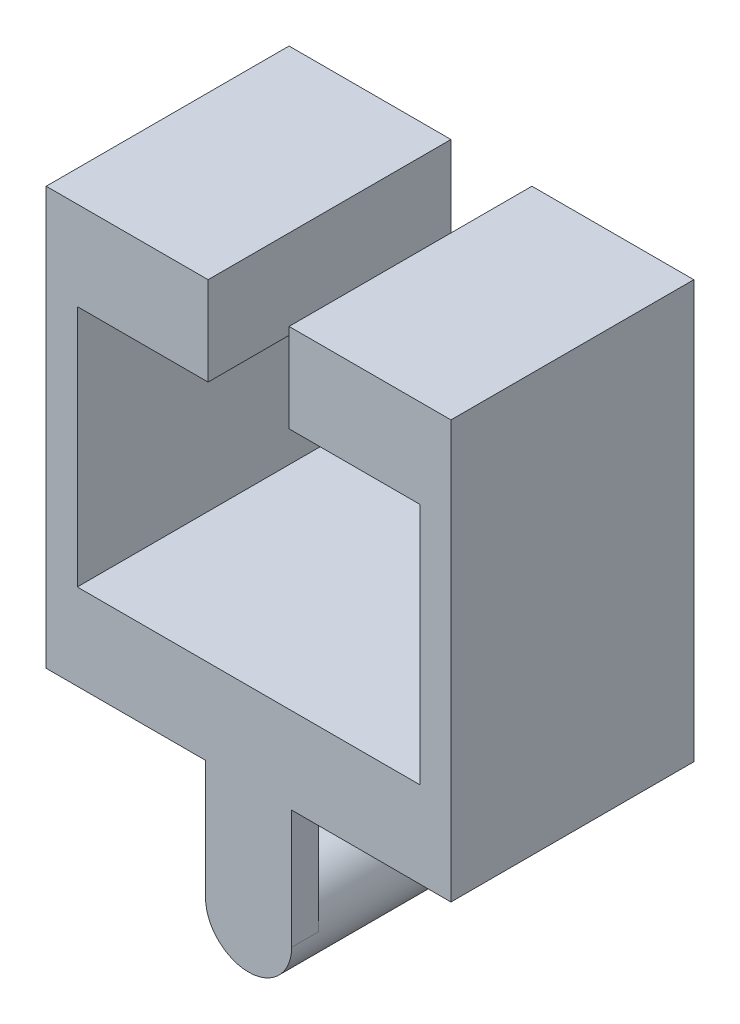
ISO-10303-21;
HEADER;
FILE_DESCRIPTION(('STEP AP214'),'2;1');
FILE_NAME('part.step','',(''),(''),'','','');
FILE_SCHEMA(('AUTOMOTIVE_DESIGN { 1 0 10303 214 1 1 1 1 }'));
ENDSEC;
DATA;
#1=APPLICATION_CONTEXT('core data for automotive mechanical design processes');
#2=APPLICATION_PROTOCOL_DEFINITION('international standard','automotive_design',2000,#1);
#3=PRODUCT_CONTEXT('',#1,'mechanical');
#4=PRODUCT('Part','Part','',(#3));
#5=PRODUCT_RELATED_PRODUCT_CATEGORY('part','',(#4));
#6=PRODUCT_DEFINITION_FORMATION('','',#4);
#7=PRODUCT_DEFINITION_CONTEXT('part definition',#1,'design');
#8=PRODUCT_DEFINITION('design','',#6,#7);
#9=PRODUCT_DEFINITION_SHAPE('','',#8);
#10=(LENGTH_UNIT() NAMED_UNIT(*) SI_UNIT(.MILLI.,.METRE.));
#11=(NAMED_UNIT(*) PLANE_ANGLE_UNIT() SI_UNIT($,.RADIAN.));
#12=(NAMED_UNIT(*) SI_UNIT($,.STERADIAN.) SOLID_ANGLE_UNIT());
#13=UNCERTAINTY_MEASURE_WITH_UNIT(LENGTH_MEASURE(1.E-05),#10,'distance_accuracy_value','');
#14=(GEOMETRIC_REPRESENTATION_CONTEXT(3) GLOBAL_UNCERTAINTY_ASSIGNED_CONTEXT((#13)) GLOBAL_UNIT_ASSIGNED_CONTEXT((#10,
#11,#12)) REPRESENTATION_CONTEXT('',''));
#15=CARTESIAN_POINT('',(0.,0.,0.));
#16=DIRECTION('',(0.,0.,1.));
#17=DIRECTION('',(1.,0.,0.));
#18=AXIS2_PLACEMENT_3D('',#15,#16,#17);
#19=CARTESIAN_POINT('',(0.,32.13862,0.));
#20=DIRECTION('',(0.,-1.,0.));
#21=DIRECTION('',(0.,0.,-1.));
#22=AXIS2_PLACEMENT_3D('',#19,#20,#21);
#23=PLANE('',#22);
#24=DIRECTION('',(0.,0.,-1.));
#25=VECTOR('',#24,1.);
#26=CARTESIAN_POINT('',(-26.8732,32.13862,38.1));
#27=LINE('',#26,#25);
#28=CARTESIAN_POINT('',(-26.8732,32.13862,38.1));
#29=VERTEX_POINT('',#28);
#30=CARTESIAN_POINT('',(-26.8732,32.13862,0.));
#31=VERTEX_POINT('',#30);
#32=EDGE_CURVE('E8382',#29,#31,#27,.T.);
#33=ORIENTED_EDGE('',*,*,#32,.F.);
#34=DIRECTION('',(1.,0.,0.));
#35=VECTOR('',#34,1.);
#36=CARTESIAN_POINT('',(0.,32.13862,38.1));
#37=LINE('',#36,#35);
#38=CARTESIAN_POINT('',(26.8732,32.13862,38.1));
#39=VERTEX_POINT('',#38);
#40=EDGE_CURVE('E8592',#29,#39,#37,.T.);
#41=ORIENTED_EDGE('',*,*,#40,.T.);
#42=DIRECTION('',(0.,0.,1.));
#43=VECTOR('',#42,1.);
#44=CARTESIAN_POINT('',(26.8732,32.13862,38.1));
#45=LINE('',#44,#43);
#46=CARTESIAN_POINT('',(26.8732,32.13862,0.));
#47=VERTEX_POINT('',#46);
#48=EDGE_CURVE('E8378',#47,#39,#45,.T.);
#49=ORIENTED_EDGE('',*,*,#48,.F.);
#50=DIRECTION('',(-1.,0.,0.));
#51=VECTOR('',#50,1.);
#52=CARTESIAN_POINT('',(-31.75,32.13862,0.));
#53=LINE('',#52,#51);
#54=EDGE_CURVE('E8488',#47,#31,#53,.T.);
#55=ORIENTED_EDGE('',*,*,#54,.T.);
#56=EDGE_LOOP('',(#33,#41,#49,#55));
#57=FACE_BOUND('',#56,.T.);
#58=ADVANCED_FACE('F8361',(#57),#23,.F.);
#59=CARTESIAN_POINT('',(0.,0.,38.1));
#60=DIRECTION('',(0.,0.,-1.));
#61=DIRECTION('',(-1.,0.,0.));
#62=AXIS2_PLACEMENT_3D('',#59,#60,#61);
#63=CYLINDRICAL_SURFACE('',#62,6.7564);
#64=CARTESIAN_POINT('',(0.,0.,33.86074));
#65=DIRECTION('',(0.,0.,1.));
#66=DIRECTION('',(1.,0.,0.));
#67=AXIS2_PLACEMENT_3D('',#64,#65,#66);
#68=CIRCLE('',#67,6.7564);
#69=CARTESIAN_POINT('',(6.7564,0.,33.86074));
#70=VERTEX_POINT('',#69);
#71=CARTESIAN_POINT('',(-6.7564,0.,33.86074));
#72=VERTEX_POINT('',#71);
#73=EDGE_CURVE('E14',#70,#72,#68,.T.);
#74=ORIENTED_EDGE('',*,*,#73,.F.);
#75=DIRECTION('',(0.,0.,1.));
#76=VECTOR('',#75,1.);
#77=CARTESIAN_POINT('',(6.7564,0.,33.86074));
#78=LINE('',#77,#76);
#79=CARTESIAN_POINT('',(6.7564,0.,38.1));
#80=VERTEX_POINT('',#79);
#81=EDGE_CURVE('E8638',#70,#80,#78,.T.);
#82=ORIENTED_EDGE('',*,*,#81,.T.);
#83=CARTESIAN_POINT('',(0.,0.,38.1));
#84=DIRECTION('',(0.,0.,1.));
#85=DIRECTION('',(1.,0.,0.));
#86=AXIS2_PLACEMENT_3D('',#83,#84,#85);
#87=CIRCLE('',#86,6.7564);
#88=CARTESIAN_POINT('',(-6.7564,0.,38.1));
#89=VERTEX_POINT('',#88);
#90=EDGE_CURVE('E8372',#89,#80,#87,.T.);
#91=ORIENTED_EDGE('',*,*,#90,.F.);
#92=DIRECTION('',(0.,0.,1.));
#93=VECTOR('',#92,1.);
#94=CARTESIAN_POINT('',(-6.7564,0.,33.86074));
#95=LINE('',#94,#93);
#96=EDGE_CURVE('E8644',#72,#89,#95,.T.);
#97=ORIENTED_EDGE('',*,*,#96,.F.);
#98=EDGE_LOOP('',(#74,#82,#91,#97));
#99=FACE_BOUND('',#98,.T.);
#100=CARTESIAN_POINT('',(0.,0.,0.));
#101=DIRECTION('',(0.,0.,1.));
#102=DIRECTION('',(1.,0.,0.));
#103=AXIS2_PLACEMENT_3D('',#100,#101,#102);
#104=CIRCLE('',#103,6.7564);
#105=CARTESIAN_POINT('',(6.7564,0.,0.));
#106=VERTEX_POINT('',#105);
#107=EDGE_CURVE('E8641',#106,#106,#104,.T.);
#108=ORIENTED_EDGE('',*,*,#107,.T.);
#109=EDGE_LOOP('',(#108));
#110=FACE_BOUND('',#109,.T.);
#111=ADVANCED_FACE('F8368',(#99,#110),#63,.T.);
#112=CARTESIAN_POINT('',(0.,0.,38.1));
#113=DIRECTION('',(0.,0.,1.));
#114=DIRECTION('',(1.,0.,0.));
#115=AXIS2_PLACEMENT_3D('',#112,#113,#114);
#116=PLANE('',#115);
#117=ORIENTED_EDGE('',*,*,#90,.T.);
#118=DIRECTION('',(0.,1.,0.));
#119=VECTOR('',#118,1.);
#120=CARTESIAN_POINT('',(6.7564,0.,38.1));
#121=LINE('',#120,#119);
#122=CARTESIAN_POINT('',(6.7564,18.6436,38.1));
#123=VERTEX_POINT('',#122);
#124=EDGE_CURVE('E8619',#80,#123,#121,.T.);
#125=ORIENTED_EDGE('',*,*,#124,.T.);
#126=DIRECTION('',(1.,0.,0.));
#127=VECTOR('',#126,1.);
#128=CARTESIAN_POINT('',(0.,18.6436,38.1));
#129=LINE('',#128,#127);
#130=CARTESIAN_POINT('',(31.75,18.6436,38.1));
#131=VERTEX_POINT('',#130);
#132=EDGE_CURVE('E8606',#123,#131,#129,.T.);
#133=ORIENTED_EDGE('',*,*,#132,.T.);
#134=DIRECTION('',(0.,-1.,0.));
#135=VECTOR('',#134,1.);
#136=CARTESIAN_POINT('',(31.75,32.13862,38.1));
#137=LINE('',#136,#135);
#138=CARTESIAN_POINT('',(31.75,84.1502,38.1));
#139=VERTEX_POINT('',#138);
#140=EDGE_CURVE('E8614',#139,#131,#137,.T.);
#141=ORIENTED_EDGE('',*,*,#140,.F.);
#142=DIRECTION('',(1.,0.,0.));
#143=VECTOR('',#142,1.);
#144=CARTESIAN_POINT('',(31.75,84.1502,38.1));
#145=LINE('',#144,#143);
#146=CARTESIAN_POINT('',(6.35,84.1502,38.1));
#147=VERTEX_POINT('',#146);
#148=EDGE_CURVE('E8554',#147,#139,#145,.T.);
#149=ORIENTED_EDGE('',*,*,#148,.F.);
#150=DIRECTION('',(0.,-1.,0.));
#151=VECTOR('',#150,1.);
#152=CARTESIAN_POINT('',(6.35,84.1502,38.1));
#153=LINE('',#152,#151);
#154=CARTESIAN_POINT('',(6.35,70.23862,38.1));
#155=VERTEX_POINT('',#154);
#156=EDGE_CURVE('E8540',#147,#155,#153,.T.);
#157=ORIENTED_EDGE('',*,*,#156,.T.);
#158=DIRECTION('',(1.,0.,0.));
#159=VECTOR('',#158,1.);
#160=CARTESIAN_POINT('',(31.75,70.23862,38.1));
#161=LINE('',#160,#159);
#162=CARTESIAN_POINT('',(26.8732,70.23862,38.1));
#163=VERTEX_POINT('',#162);
#164=EDGE_CURVE('E8545',#155,#163,#161,.T.);
#165=ORIENTED_EDGE('',*,*,#164,.T.);
#166=DIRECTION('',(0.,-1.,0.));
#167=VECTOR('',#166,1.);
#168=CARTESIAN_POINT('',(26.8732,70.23862,38.1));
#169=LINE('',#168,#167);
#170=EDGE_CURVE('E8584',#163,#39,#169,.T.);
#171=ORIENTED_EDGE('',*,*,#170,.T.);
#172=ORIENTED_EDGE('',*,*,#40,.F.);
#173=DIRECTION('',(0.,-1.,0.));
#174=VECTOR('',#173,1.);
#175=CARTESIAN_POINT('',(-26.8732,70.23862,38.1));
#176=LINE('',#175,#174);
#177=CARTESIAN_POINT('',(-26.8732,70.23862,38.1));
#178=VERTEX_POINT('',#177);
#179=EDGE_CURVE('E8574',#178,#29,#176,.T.);
#180=ORIENTED_EDGE('',*,*,#179,.F.);
#181=DIRECTION('',(1.,0.,0.));
#182=VECTOR('',#181,1.);
#183=CARTESIAN_POINT('',(-31.75,70.23862,38.1));
#184=LINE('',#183,#182);
#185=CARTESIAN_POINT('',(-6.35,70.23862,38.1));
#186=VERTEX_POINT('',#185);
#187=EDGE_CURVE('E8521',#178,#186,#184,.T.);
#188=ORIENTED_EDGE('',*,*,#187,.T.);
#189=DIRECTION('',(0.,-1.,0.));
#190=VECTOR('',#189,1.);
#191=CARTESIAN_POINT('',(-6.35,84.1502,38.1));
#192=LINE('',#191,#190);
#193=CARTESIAN_POINT('',(-6.35,84.1502,38.1));
#194=VERTEX_POINT('',#193);
#195=EDGE_CURVE('E8500',#194,#186,#192,.T.);
#196=ORIENTED_EDGE('',*,*,#195,.F.);
#197=DIRECTION('',(1.,0.,0.));
#198=VECTOR('',#197,1.);
#199=CARTESIAN_POINT('',(-31.75,84.1502,38.1));
#200=LINE('',#199,#198);
#201=CARTESIAN_POINT('',(-31.75,84.1502,38.1));
#202=VERTEX_POINT('',#201);
#203=EDGE_CURVE('E8491',#202,#194,#200,.T.);
#204=ORIENTED_EDGE('',*,*,#203,.F.);
#205=DIRECTION('',(0.,-1.,0.));
#206=VECTOR('',#205,1.);
#207=CARTESIAN_POINT('',(-31.75,32.13862,38.1));
#208=LINE('',#207,#206);
#209=CARTESIAN_POINT('',(-31.75,18.6436,38.1));
#210=VERTEX_POINT('',#209);
#211=EDGE_CURVE('E8480',#202,#210,#208,.T.);
#212=ORIENTED_EDGE('',*,*,#211,.T.);
#213=CARTESIAN_POINT('',(-6.7564,18.6436,38.1));
#214=VERTEX_POINT('',#213);
#215=EDGE_CURVE('E8597',#210,#214,#129,.T.);
#216=ORIENTED_EDGE('',*,*,#215,.T.);
#217=DIRECTION('',(0.,-1.,0.));
#218=VECTOR('',#217,1.);
#219=CARTESIAN_POINT('',(-6.7564,18.6436,38.1));
#220=LINE('',#219,#218);
#221=EDGE_CURVE('E8624',#214,#89,#220,.T.);
#222=ORIENTED_EDGE('',*,*,#221,.T.);
#223=EDGE_LOOP('',(#117,#125,#133,#141,#149,#157,#165,#171,#172,#180,#188,#196,#204,#212,#216,#222));
#224=FACE_BOUND('',#223,.T.);
#225=ADVANCED_FACE('F8492',(#224),#116,.T.);
#226=CARTESIAN_POINT('',(0.,0.,0.));
#227=DIRECTION('',(0.,0.,1.));
#228=DIRECTION('',(1.,0.,0.));
#229=AXIS2_PLACEMENT_3D('',#226,#227,#228);
#230=PLANE('',#229);
#231=ORIENTED_EDGE('',*,*,#107,.F.);
#232=EDGE_LOOP('',(#231));
#233=FACE_BOUND('',#232,.T.);
#234=ADVANCED_FACE('F8661',(#233),#230,.F.);
#235=CARTESIAN_POINT('',(6.7564,0.,33.86074));
#236=DIRECTION('',(1.,0.,0.));
#237=DIRECTION('',(0.,1.,0.));
#238=AXIS2_PLACEMENT_3D('',#235,#236,#237);
#239=PLANE('',#238);
#240=ORIENTED_EDGE('',*,*,#124,.F.);
#241=ORIENTED_EDGE('',*,*,#81,.F.);
#242=DIRECTION('',(0.,1.,0.));
#243=VECTOR('',#242,1.);
#244=CARTESIAN_POINT('',(6.7564,0.,33.86074));
#245=LINE('',#244,#243);
#246=CARTESIAN_POINT('',(6.7564,18.6436,33.86074));
#247=VERTEX_POINT('',#246);
#248=EDGE_CURVE('E8617',#70,#247,#245,.T.);
#249=ORIENTED_EDGE('',*,*,#248,.T.);
#250=DIRECTION('',(0.,0.,1.));
#251=VECTOR('',#250,1.);
#252=CARTESIAN_POINT('',(6.7564,18.6436,33.86074));
#253=LINE('',#252,#251);
#254=EDGE_CURVE('E8632',#247,#123,#253,.T.);
#255=ORIENTED_EDGE('',*,*,#254,.T.);
#256=EDGE_LOOP('',(#240,#241,#249,#255));
#257=FACE_BOUND('',#256,.T.);
#258=ADVANCED_FACE('F8662',(#257),#239,.T.);
#259=CARTESIAN_POINT('',(-6.7564,18.6436,33.86074));
#260=DIRECTION('',(-1.,0.,0.));
#261=DIRECTION('',(0.,-1.,0.));
#262=AXIS2_PLACEMENT_3D('',#259,#260,#261);
#263=PLANE('',#262);
#264=ORIENTED_EDGE('',*,*,#221,.F.);
#265=DIRECTION('',(0.,0.,1.));
#266=VECTOR('',#265,1.);
#267=CARTESIAN_POINT('',(-6.7564,18.6436,33.86074));
#268=LINE('',#267,#266);
#269=CARTESIAN_POINT('',(-6.7564,18.6436,33.86074));
#270=VERTEX_POINT('',#269);
#271=EDGE_CURVE('E8647',#270,#214,#268,.T.);
#272=ORIENTED_EDGE('',*,*,#271,.F.);
#273=DIRECTION('',(0.,-1.,0.));
#274=VECTOR('',#273,1.);
#275=CARTESIAN_POINT('',(-6.7564,18.6436,33.86074));
#276=LINE('',#275,#274);
#277=EDGE_CURVE('E8627',#270,#72,#276,.T.);
#278=ORIENTED_EDGE('',*,*,#277,.T.);
#279=ORIENTED_EDGE('',*,*,#96,.T.);
#280=EDGE_LOOP('',(#264,#272,#278,#279));
#281=FACE_BOUND('',#280,.T.);
#282=ADVANCED_FACE('F8666',(#281),#263,.T.);
#283=CARTESIAN_POINT('',(0.,0.,33.86074));
#284=DIRECTION('',(0.,0.,1.));
#285=DIRECTION('',(1.,0.,0.));
#286=AXIS2_PLACEMENT_3D('',#283,#284,#285);
#287=PLANE('',#286);
#288=ORIENTED_EDGE('',*,*,#248,.F.);
#289=ORIENTED_EDGE('',*,*,#73,.T.);
#290=ORIENTED_EDGE('',*,*,#277,.F.);
#291=DIRECTION('',(-1.,0.,0.));
#292=VECTOR('',#291,1.);
#293=CARTESIAN_POINT('',(6.7564,18.6436,33.86074));
#294=LINE('',#293,#292);
#295=EDGE_CURVE('E8622',#247,#270,#294,.T.);
#296=ORIENTED_EDGE('',*,*,#295,.F.);
#297=EDGE_LOOP('',(#288,#289,#290,#296));
#298=FACE_BOUND('',#297,.T.);
#299=ADVANCED_FACE('F8686',(#298),#287,.F.);
#300=CARTESIAN_POINT('',(0.,18.6436,0.));
#301=DIRECTION('',(0.,-1.,0.));
#302=DIRECTION('',(0.,0.,-1.));
#303=AXIS2_PLACEMENT_3D('',#300,#301,#302);
#304=PLANE('',#303);
#305=ORIENTED_EDGE('',*,*,#254,.F.);
#306=ORIENTED_EDGE('',*,*,#295,.T.);
#307=ORIENTED_EDGE('',*,*,#271,.T.);
#308=ORIENTED_EDGE('',*,*,#215,.F.);
#309=DIRECTION('',(0.,0.,1.));
#310=VECTOR('',#309,1.);
#311=CARTESIAN_POINT('',(-31.75,18.6436,38.1));
#312=LINE('',#311,#310);
#313=CARTESIAN_POINT('',(-31.75,18.6436,0.));
#314=VERTEX_POINT('',#313);
#315=EDGE_CURVE('E8483',#314,#210,#312,.T.);
#316=ORIENTED_EDGE('',*,*,#315,.F.);
#317=DIRECTION('',(-1.,0.,0.));
#318=VECTOR('',#317,1.);
#319=CARTESIAN_POINT('',(-31.75,18.6436,0.));
#320=LINE('',#319,#318);
#321=CARTESIAN_POINT('',(31.75,18.6436,0.));
#322=VERTEX_POINT('',#321);
#323=EDGE_CURVE('E8603',#322,#314,#320,.T.);
#324=ORIENTED_EDGE('',*,*,#323,.F.);
#325=DIRECTION('',(0.,0.,-1.));
#326=VECTOR('',#325,1.);
#327=CARTESIAN_POINT('',(31.75,18.6436,0.));
#328=LINE('',#327,#326);
#329=EDGE_CURVE('E8578',#131,#322,#328,.T.);
#330=ORIENTED_EDGE('',*,*,#329,.F.);
#331=ORIENTED_EDGE('',*,*,#132,.F.);
#332=EDGE_LOOP('',(#305,#306,#307,#308,#316,#324,#330,#331));
#333=FACE_BOUND('',#332,.T.);
#334=ADVANCED_FACE('F8683',(#333),#304,.T.);
#335=CARTESIAN_POINT('',(31.75,32.13862,0.));
#336=DIRECTION('',(-1.,0.,0.));
#337=DIRECTION('',(0.,0.,1.));
#338=AXIS2_PLACEMENT_3D('',#335,#336,#337);
#339=PLANE('',#338);
#340=ORIENTED_EDGE('',*,*,#329,.T.);
#341=DIRECTION('',(0.,-1.,0.));
#342=VECTOR('',#341,1.);
#343=CARTESIAN_POINT('',(31.75,32.13862,0.));
#344=LINE('',#343,#342);
#345=CARTESIAN_POINT('',(31.75,84.1502,0.));
#346=VERTEX_POINT('',#345);
#347=EDGE_CURVE('E8613',#346,#322,#344,.T.);
#348=ORIENTED_EDGE('',*,*,#347,.F.);
#349=DIRECTION('',(0.,0.,-1.));
#350=VECTOR('',#349,1.);
#351=CARTESIAN_POINT('',(31.75,84.1502,0.));
#352=LINE('',#351,#350);
#353=EDGE_CURVE('E8542',#139,#346,#352,.T.);
#354=ORIENTED_EDGE('',*,*,#353,.F.);
#355=ORIENTED_EDGE('',*,*,#140,.T.);
#356=EDGE_LOOP('',(#340,#348,#354,#355));
#357=FACE_BOUND('',#356,.T.);
#358=ADVANCED_FACE('F8684',(#357),#339,.F.);
#359=CARTESIAN_POINT('',(-31.75,32.13862,0.));
#360=DIRECTION('',(0.,0.,1.));
#361=DIRECTION('',(1.,0.,0.));
#362=AXIS2_PLACEMENT_3D('',#359,#360,#361);
#363=PLANE('',#362);
#364=ORIENTED_EDGE('',*,*,#323,.T.);
#365=DIRECTION('',(0.,-1.,0.));
#366=VECTOR('',#365,1.);
#367=CARTESIAN_POINT('',(-31.75,32.13862,0.));
#368=LINE('',#367,#366);
#369=CARTESIAN_POINT('',(-31.75,84.1502,0.));
#370=VERTEX_POINT('',#369);
#371=EDGE_CURVE('E8489',#370,#314,#368,.T.);
#372=ORIENTED_EDGE('',*,*,#371,.F.);
#373=DIRECTION('',(-1.,0.,0.));
#374=VECTOR('',#373,1.);
#375=CARTESIAN_POINT('',(-31.75,84.1502,0.));
#376=LINE('',#375,#374);
#377=CARTESIAN_POINT('',(-6.35,84.1502,0.));
#378=VERTEX_POINT('',#377);
#379=EDGE_CURVE('E8508',#378,#370,#376,.T.);
#380=ORIENTED_EDGE('',*,*,#379,.F.);
#381=DIRECTION('',(0.,-1.,0.));
#382=VECTOR('',#381,1.);
#383=CARTESIAN_POINT('',(-6.35,84.1502,0.));
#384=LINE('',#383,#382);
#385=CARTESIAN_POINT('',(-6.35,70.23862,0.));
#386=VERTEX_POINT('',#385);
#387=EDGE_CURVE('E8519',#378,#386,#384,.T.);
#388=ORIENTED_EDGE('',*,*,#387,.T.);
#389=DIRECTION('',(-1.,0.,0.));
#390=VECTOR('',#389,1.);
#391=CARTESIAN_POINT('',(-31.75,70.23862,0.));
#392=LINE('',#391,#390);
#393=CARTESIAN_POINT('',(-26.8732,70.23862,0.));
#394=VERTEX_POINT('',#393);
#395=EDGE_CURVE('E8506',#386,#394,#392,.T.);
#396=ORIENTED_EDGE('',*,*,#395,.T.);
#397=DIRECTION('',(0.,-1.,0.));
#398=VECTOR('',#397,1.);
#399=CARTESIAN_POINT('',(-26.8732,70.23862,0.));
#400=LINE('',#399,#398);
#401=EDGE_CURVE('E8567',#394,#31,#400,.T.);
#402=ORIENTED_EDGE('',*,*,#401,.T.);
#403=ORIENTED_EDGE('',*,*,#54,.F.);
#404=DIRECTION('',(0.,-1.,0.));
#405=VECTOR('',#404,1.);
#406=CARTESIAN_POINT('',(26.8732,70.23862,0.));
#407=LINE('',#406,#405);
#408=CARTESIAN_POINT('',(26.8732,70.23862,0.));
#409=VERTEX_POINT('',#408);
#410=EDGE_CURVE('E8535',#409,#47,#407,.T.);
#411=ORIENTED_EDGE('',*,*,#410,.F.);
#412=DIRECTION('',(-1.,0.,0.));
#413=VECTOR('',#412,1.);
#414=CARTESIAN_POINT('',(6.35,70.23862,0.));
#415=LINE('',#414,#413);
#416=CARTESIAN_POINT('',(6.35,70.23862,0.));
#417=VERTEX_POINT('',#416);
#418=EDGE_CURVE('E8523',#409,#417,#415,.T.);
#419=ORIENTED_EDGE('',*,*,#418,.T.);
#420=DIRECTION('',(0.,-1.,0.));
#421=VECTOR('',#420,1.);
#422=CARTESIAN_POINT('',(6.35,84.1502,0.));
#423=LINE('',#422,#421);
#424=CARTESIAN_POINT('',(6.35,84.1502,0.));
#425=VERTEX_POINT('',#424);
#426=EDGE_CURVE('E8531',#425,#417,#423,.T.);
#427=ORIENTED_EDGE('',*,*,#426,.F.);
#428=DIRECTION('',(-1.,0.,0.));
#429=VECTOR('',#428,1.);
#430=CARTESIAN_POINT('',(6.35,84.1502,0.));
#431=LINE('',#430,#429);
#432=EDGE_CURVE('E8550',#346,#425,#431,.T.);
#433=ORIENTED_EDGE('',*,*,#432,.F.);
#434=ORIENTED_EDGE('',*,*,#347,.T.);
#435=EDGE_LOOP('',(#364,#372,#380,#388,#396,#402,#403,#411,#419,#427,#433,#434));
#436=FACE_BOUND('',#435,.T.);
#437=ADVANCED_FACE('F8689',(#436),#363,.F.);
#438=CARTESIAN_POINT('',(-31.75,32.13862,38.1));
#439=DIRECTION('',(1.,0.,0.));
#440=DIRECTION('',(0.,0.,-1.));
#441=AXIS2_PLACEMENT_3D('',#438,#439,#440);
#442=PLANE('',#441);
#443=ORIENTED_EDGE('',*,*,#315,.T.);
#444=ORIENTED_EDGE('',*,*,#211,.F.);
#445=DIRECTION('',(0.,0.,1.));
#446=VECTOR('',#445,1.);
#447=CARTESIAN_POINT('',(-31.75,84.1502,0.));
#448=LINE('',#447,#446);
#449=EDGE_CURVE('E8485',#370,#202,#448,.T.);
#450=ORIENTED_EDGE('',*,*,#449,.F.);
#451=ORIENTED_EDGE('',*,*,#371,.T.);
#452=EDGE_LOOP('',(#443,#444,#450,#451));
#453=FACE_BOUND('',#452,.T.);
#454=ADVANCED_FACE('F8479',(#453),#442,.F.);
#455=CARTESIAN_POINT('',(26.8732,70.23862,38.1));
#456=DIRECTION('',(1.,0.,0.));
#457=DIRECTION('',(0.,0.,-1.));
#458=AXIS2_PLACEMENT_3D('',#455,#456,#457);
#459=PLANE('',#458);
#460=ORIENTED_EDGE('',*,*,#48,.T.);
#461=ORIENTED_EDGE('',*,*,#170,.F.);
#462=DIRECTION('',(0.,0.,1.));
#463=VECTOR('',#462,1.);
#464=CARTESIAN_POINT('',(26.8732,70.23862,38.1));
#465=LINE('',#464,#463);
#466=EDGE_CURVE('E8590',#409,#163,#465,.T.);
#467=ORIENTED_EDGE('',*,*,#466,.F.);
#468=ORIENTED_EDGE('',*,*,#410,.T.);
#469=EDGE_LOOP('',(#460,#461,#467,#468));
#470=FACE_BOUND('',#469,.T.);
#471=ADVANCED_FACE('F8681',(#470),#459,.F.);
#472=CARTESIAN_POINT('',(-26.8732,70.23862,38.1));
#473=DIRECTION('',(-1.,0.,0.));
#474=DIRECTION('',(0.,0.,1.));
#475=AXIS2_PLACEMENT_3D('',#472,#473,#474);
#476=PLANE('',#475);
#477=ORIENTED_EDGE('',*,*,#32,.T.);
#478=ORIENTED_EDGE('',*,*,#401,.F.);
#479=DIRECTION('',(0.,0.,-1.));
#480=VECTOR('',#479,1.);
#481=CARTESIAN_POINT('',(-26.8732,70.23862,38.1));
#482=LINE('',#481,#480);
#483=EDGE_CURVE('E8562',#178,#394,#482,.T.);
#484=ORIENTED_EDGE('',*,*,#483,.F.);
#485=ORIENTED_EDGE('',*,*,#179,.T.);
#486=EDGE_LOOP('',(#477,#478,#484,#485));
#487=FACE_BOUND('',#486,.T.);
#488=ADVANCED_FACE('F8761',(#487),#476,.F.);
#489=CARTESIAN_POINT('',(0.,70.23862,0.));
#490=DIRECTION('',(0.,1.,0.));
#491=DIRECTION('',(0.,0.,1.));
#492=AXIS2_PLACEMENT_3D('',#489,#490,#491);
#493=PLANE('',#492);
#494=ORIENTED_EDGE('',*,*,#187,.F.);
#495=ORIENTED_EDGE('',*,*,#483,.T.);
#496=ORIENTED_EDGE('',*,*,#395,.F.);
#497=DIRECTION('',(0.,0.,-1.));
#498=VECTOR('',#497,1.);
#499=CARTESIAN_POINT('',(-6.35,70.23862,38.1));
#500=LINE('',#499,#498);
#501=EDGE_CURVE('E8513',#186,#386,#500,.T.);
#502=ORIENTED_EDGE('',*,*,#501,.F.);
#503=EDGE_LOOP('',(#494,#495,#496,#502));
#504=FACE_BOUND('',#503,.T.);
#505=ADVANCED_FACE('F8775',(#504),#493,.F.);
#506=CARTESIAN_POINT('',(-6.35,84.1502,38.1));
#507=DIRECTION('',(-1.,0.,0.));
#508=DIRECTION('',(0.,0.,1.));
#509=AXIS2_PLACEMENT_3D('',#506,#507,#508);
#510=PLANE('',#509);
#511=ORIENTED_EDGE('',*,*,#501,.T.);
#512=ORIENTED_EDGE('',*,*,#387,.F.);
#513=DIRECTION('',(0.,0.,-1.));
#514=VECTOR('',#513,1.);
#515=CARTESIAN_POINT('',(-6.35,84.1502,38.1));
#516=LINE('',#515,#514);
#517=EDGE_CURVE('E8503',#194,#378,#516,.T.);
#518=ORIENTED_EDGE('',*,*,#517,.F.);
#519=ORIENTED_EDGE('',*,*,#195,.T.);
#520=EDGE_LOOP('',(#511,#512,#518,#519));
#521=FACE_BOUND('',#520,.T.);
#522=ADVANCED_FACE('F8769',(#521),#510,.F.);
#523=CARTESIAN_POINT('',(0.,84.1502,0.));
#524=DIRECTION('',(0.,1.,0.));
#525=DIRECTION('',(0.,0.,1.));
#526=AXIS2_PLACEMENT_3D('',#523,#524,#525);
#527=PLANE('',#526);
#528=ORIENTED_EDGE('',*,*,#449,.T.);
#529=ORIENTED_EDGE('',*,*,#203,.T.);
#530=ORIENTED_EDGE('',*,*,#517,.T.);
#531=ORIENTED_EDGE('',*,*,#379,.T.);
#532=EDGE_LOOP('',(#528,#529,#530,#531));
#533=FACE_BOUND('',#532,.T.);
#534=ADVANCED_FACE('F8505',(#533),#527,.T.);
#535=CARTESIAN_POINT('',(6.35,84.1502,38.1));
#536=DIRECTION('',(1.,0.,0.));
#537=DIRECTION('',(0.,0.,-1.));
#538=AXIS2_PLACEMENT_3D('',#535,#536,#537);
#539=PLANE('',#538);
#540=DIRECTION('',(0.,0.,1.));
#541=VECTOR('',#540,1.);
#542=CARTESIAN_POINT('',(6.35,70.23862,38.1));
#543=LINE('',#542,#541);
#544=EDGE_CURVE('E8548',#417,#155,#543,.T.);
#545=ORIENTED_EDGE('',*,*,#544,.T.);
#546=ORIENTED_EDGE('',*,*,#156,.F.);
#547=DIRECTION('',(0.,0.,1.));
#548=VECTOR('',#547,1.);
#549=CARTESIAN_POINT('',(6.35,84.1502,38.1));
#550=LINE('',#549,#548);
#551=EDGE_CURVE('E8560',#425,#147,#550,.T.);
#552=ORIENTED_EDGE('',*,*,#551,.F.);
#553=ORIENTED_EDGE('',*,*,#426,.T.);
#554=EDGE_LOOP('',(#545,#546,#552,#553));
#555=FACE_BOUND('',#554,.T.);
#556=ADVANCED_FACE('F8754',(#555),#539,.F.);
#557=CARTESIAN_POINT('',(0.,84.1502,0.));
#558=DIRECTION('',(0.,-1.,0.));
#559=DIRECTION('',(0.,0.,-1.));
#560=AXIS2_PLACEMENT_3D('',#557,#558,#559);
#561=PLANE('',#560);
#562=ORIENTED_EDGE('',*,*,#432,.T.);
#563=ORIENTED_EDGE('',*,*,#551,.T.);
#564=ORIENTED_EDGE('',*,*,#148,.T.);
#565=ORIENTED_EDGE('',*,*,#353,.T.);
#566=EDGE_LOOP('',(#562,#563,#564,#565));
#567=FACE_BOUND('',#566,.T.);
#568=ADVANCED_FACE('F8746',(#567),#561,.F.);
#569=CARTESIAN_POINT('',(0.,70.23862,0.));
#570=DIRECTION('',(0.,-1.,0.));
#571=DIRECTION('',(0.,0.,-1.));
#572=AXIS2_PLACEMENT_3D('',#569,#570,#571);
#573=PLANE('',#572);
#574=ORIENTED_EDGE('',*,*,#418,.F.);
#575=ORIENTED_EDGE('',*,*,#466,.T.);
#576=ORIENTED_EDGE('',*,*,#164,.F.);
#577=ORIENTED_EDGE('',*,*,#544,.F.);
#578=EDGE_LOOP('',(#574,#575,#576,#577));
#579=FACE_BOUND('',#578,.T.);
#580=ADVANCED_FACE('F8758',(#579),#573,.T.);
#581=CLOSED_SHELL('',(#58,#111,#225,#234,#258,#282,#299,#334,#358,#437,#454,#471,#488,#505,#522,
#534,#556,#568,#580));
#582=MANIFOLD_SOLID_BREP('B2',#581);
#583=ADVANCED_BREP_SHAPE_REPRESENTATION('',(#18,#582),#14);
#584=SHAPE_DEFINITION_REPRESENTATION(#9,#583);
ENDSEC;
END-ISO-10303-21;
